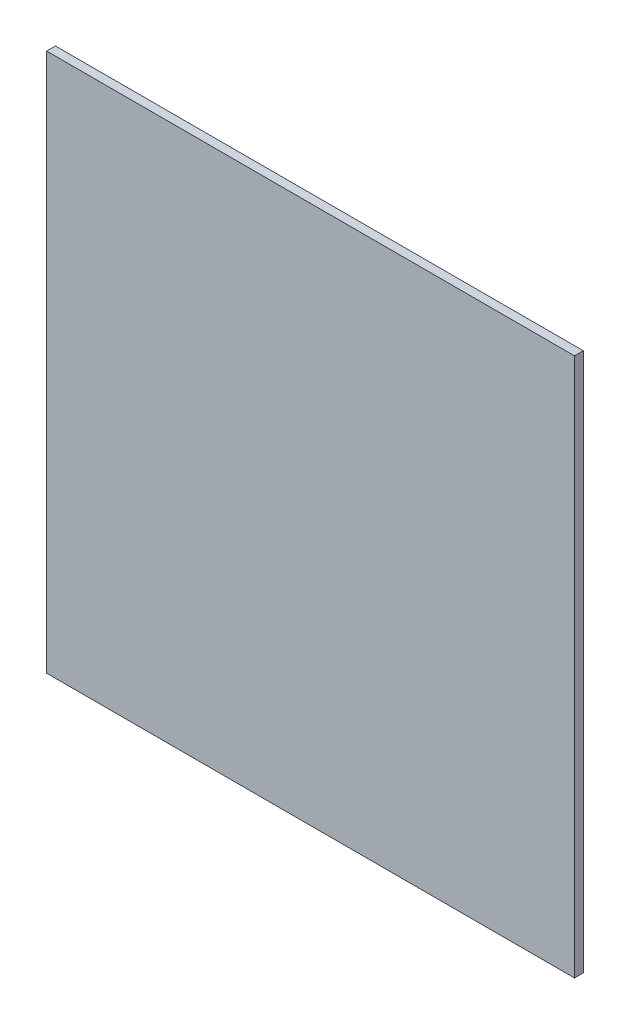
ISO-10303-21;
HEADER;
FILE_DESCRIPTION(('STEP AP214'),'2;1');
FILE_NAME('part.step','',(''),(''),'','','');
FILE_SCHEMA(('AUTOMOTIVE_DESIGN { 1 0 10303 214 1 1 1 1 }'));
ENDSEC;
DATA;
#1=APPLICATION_CONTEXT('core data for automotive mechanical design processes');
#2=APPLICATION_PROTOCOL_DEFINITION('international standard','automotive_design',2000,#1);
#3=PRODUCT_CONTEXT('',#1,'mechanical');
#4=PRODUCT('Part','Part','',(#3));
#5=PRODUCT_RELATED_PRODUCT_CATEGORY('part','',(#4));
#6=PRODUCT_DEFINITION_FORMATION('','',#4);
#7=PRODUCT_DEFINITION_CONTEXT('part definition',#1,'design');
#8=PRODUCT_DEFINITION('design','',#6,#7);
#9=PRODUCT_DEFINITION_SHAPE('','',#8);
#10=(LENGTH_UNIT() NAMED_UNIT(*) SI_UNIT(.MILLI.,.METRE.));
#11=(NAMED_UNIT(*) PLANE_ANGLE_UNIT() SI_UNIT($,.RADIAN.));
#12=(NAMED_UNIT(*) SI_UNIT($,.STERADIAN.) SOLID_ANGLE_UNIT());
#13=UNCERTAINTY_MEASURE_WITH_UNIT(LENGTH_MEASURE(1.E-05),#10,'distance_accuracy_value','');
#14=(GEOMETRIC_REPRESENTATION_CONTEXT(3) GLOBAL_UNCERTAINTY_ASSIGNED_CONTEXT((#13)) GLOBAL_UNIT_ASSIGNED_CONTEXT((#10,
#11,#12)) REPRESENTATION_CONTEXT('',''));
#15=CARTESIAN_POINT('',(0.,0.,0.));
#16=DIRECTION('',(0.,0.,1.));
#17=DIRECTION('',(1.,0.,0.));
#18=AXIS2_PLACEMENT_3D('',#15,#16,#17);
#19=CARTESIAN_POINT('',(240.,245.,8.));
#20=DIRECTION('',(-1.,0.,0.));
#21=DIRECTION('',(0.,-1.,0.));
#22=AXIS2_PLACEMENT_3D('',#19,#20,#21);
#23=PLANE('',#22);
#24=DIRECTION('',(0.,1.,0.));
#25=VECTOR('',#24,1.);
#26=CARTESIAN_POINT('',(240.,245.,0.));
#27=LINE('',#26,#25);
#28=CARTESIAN_POINT('',(240.,-245.,0.));
#29=VERTEX_POINT('',#28);
#30=CARTESIAN_POINT('',(240.,245.,0.));
#31=VERTEX_POINT('',#30);
#32=EDGE_CURVE('E95',#29,#31,#27,.T.);
#33=ORIENTED_EDGE('',*,*,#32,.T.);
#34=DIRECTION('',(0.,0.,-1.));
#35=VECTOR('',#34,1.);
#36=CARTESIAN_POINT('',(240.,245.,8.));
#37=LINE('',#36,#35);
#38=CARTESIAN_POINT('',(240.,245.,8.));
#39=VERTEX_POINT('',#38);
#40=EDGE_CURVE('E11',#39,#31,#37,.T.);
#41=ORIENTED_EDGE('',*,*,#40,.F.);
#42=DIRECTION('',(0.,1.,0.));
#43=VECTOR('',#42,1.);
#44=CARTESIAN_POINT('',(240.,245.,8.));
#45=LINE('',#44,#43);
#46=CARTESIAN_POINT('',(240.,-245.,8.));
#47=VERTEX_POINT('',#46);
#48=EDGE_CURVE('E83',#47,#39,#45,.T.);
#49=ORIENTED_EDGE('',*,*,#48,.F.);
#50=DIRECTION('',(0.,0.,-1.));
#51=VECTOR('',#50,1.);
#52=CARTESIAN_POINT('',(240.,-245.,8.));
#53=LINE('',#52,#51);
#54=EDGE_CURVE('E91',#47,#29,#53,.T.);
#55=ORIENTED_EDGE('',*,*,#54,.T.);
#56=EDGE_LOOP('',(#33,#41,#49,#55));
#57=FACE_BOUND('',#56,.T.);
#58=ADVANCED_FACE('F32',(#57),#23,.F.);
#59=CARTESIAN_POINT('',(-240.,245.,8.));
#60=DIRECTION('',(0.,-1.,0.));
#61=DIRECTION('',(0.,0.,-1.));
#62=AXIS2_PLACEMENT_3D('',#59,#60,#61);
#63=PLANE('',#62);
#64=DIRECTION('',(-1.,0.,0.));
#65=VECTOR('',#64,1.);
#66=CARTESIAN_POINT('',(-240.,245.,0.));
#67=LINE('',#66,#65);
#68=CARTESIAN_POINT('',(-240.,245.,0.));
#69=VERTEX_POINT('',#68);
#70=EDGE_CURVE('E87',#31,#69,#67,.T.);
#71=ORIENTED_EDGE('',*,*,#70,.T.);
#72=DIRECTION('',(0.,0.,-1.));
#73=VECTOR('',#72,1.);
#74=CARTESIAN_POINT('',(-240.,245.,8.));
#75=LINE('',#74,#73);
#76=CARTESIAN_POINT('',(-240.,245.,8.));
#77=VERTEX_POINT('',#76);
#78=EDGE_CURVE('E40',#77,#69,#75,.T.);
#79=ORIENTED_EDGE('',*,*,#78,.F.);
#80=DIRECTION('',(-1.,0.,0.));
#81=VECTOR('',#80,1.);
#82=CARTESIAN_POINT('',(-240.,245.,8.));
#83=LINE('',#82,#81);
#84=EDGE_CURVE('E78',#39,#77,#83,.T.);
#85=ORIENTED_EDGE('',*,*,#84,.F.);
#86=ORIENTED_EDGE('',*,*,#40,.T.);
#87=EDGE_LOOP('',(#71,#79,#85,#86));
#88=FACE_BOUND('',#87,.T.);
#89=ADVANCED_FACE('F86',(#88),#63,.F.);
#90=CARTESIAN_POINT('',(-240.,245.,8.));
#91=DIRECTION('',(1.,0.,0.));
#92=DIRECTION('',(0.,1.,0.));
#93=AXIS2_PLACEMENT_3D('',#90,#91,#92);
#94=PLANE('',#93);
#95=DIRECTION('',(0.,-1.,0.));
#96=VECTOR('',#95,1.);
#97=CARTESIAN_POINT('',(-240.,245.,0.));
#98=LINE('',#97,#96);
#99=CARTESIAN_POINT('',(-240.,-245.,0.));
#100=VERTEX_POINT('',#99);
#101=EDGE_CURVE('E65',#69,#100,#98,.T.);
#102=ORIENTED_EDGE('',*,*,#101,.T.);
#103=DIRECTION('',(0.,0.,-1.));
#104=VECTOR('',#103,1.);
#105=CARTESIAN_POINT('',(-240.,-245.,8.));
#106=LINE('',#105,#104);
#107=CARTESIAN_POINT('',(-240.,-245.,8.));
#108=VERTEX_POINT('',#107);
#109=EDGE_CURVE('E88',#108,#100,#106,.T.);
#110=ORIENTED_EDGE('',*,*,#109,.F.);
#111=DIRECTION('',(0.,-1.,0.));
#112=VECTOR('',#111,1.);
#113=CARTESIAN_POINT('',(-240.,245.,8.));
#114=LINE('',#113,#112);
#115=EDGE_CURVE('E81',#77,#108,#114,.T.);
#116=ORIENTED_EDGE('',*,*,#115,.F.);
#117=ORIENTED_EDGE('',*,*,#78,.T.);
#118=EDGE_LOOP('',(#102,#110,#116,#117));
#119=FACE_BOUND('',#118,.T.);
#120=ADVANCED_FACE('F89',(#119),#94,.F.);
#121=CARTESIAN_POINT('',(-240.,-245.,8.));
#122=DIRECTION('',(0.,1.,0.));
#123=DIRECTION('',(0.,0.,1.));
#124=AXIS2_PLACEMENT_3D('',#121,#122,#123);
#125=PLANE('',#124);
#126=DIRECTION('',(1.,0.,0.));
#127=VECTOR('',#126,1.);
#128=CARTESIAN_POINT('',(-240.,-245.,0.));
#129=LINE('',#128,#127);
#130=EDGE_CURVE('E71',#100,#29,#129,.T.);
#131=ORIENTED_EDGE('',*,*,#130,.T.);
#132=ORIENTED_EDGE('',*,*,#54,.F.);
#133=DIRECTION('',(1.,0.,0.));
#134=VECTOR('',#133,1.);
#135=CARTESIAN_POINT('',(-240.,-245.,8.));
#136=LINE('',#135,#134);
#137=EDGE_CURVE('E48',#108,#47,#136,.T.);
#138=ORIENTED_EDGE('',*,*,#137,.F.);
#139=ORIENTED_EDGE('',*,*,#109,.T.);
#140=EDGE_LOOP('',(#131,#132,#138,#139));
#141=FACE_BOUND('',#140,.T.);
#142=ADVANCED_FACE('F102',(#141),#125,.F.);
#143=CARTESIAN_POINT('',(0.,0.,8.));
#144=DIRECTION('',(0.,0.,1.));
#145=DIRECTION('',(1.,0.,0.));
#146=AXIS2_PLACEMENT_3D('',#143,#144,#145);
#147=PLANE('',#146);
#148=ORIENTED_EDGE('',*,*,#48,.T.);
#149=ORIENTED_EDGE('',*,*,#84,.T.);
#150=ORIENTED_EDGE('',*,*,#115,.T.);
#151=ORIENTED_EDGE('',*,*,#137,.T.);
#152=EDGE_LOOP('',(#148,#149,#150,#151));
#153=FACE_BOUND('',#152,.T.);
#154=ADVANCED_FACE('F79',(#153),#147,.T.);
#155=CARTESIAN_POINT('',(0.,0.,0.));
#156=DIRECTION('',(0.,0.,1.));
#157=DIRECTION('',(1.,0.,0.));
#158=AXIS2_PLACEMENT_3D('',#155,#156,#157);
#159=PLANE('',#158);
#160=ORIENTED_EDGE('',*,*,#32,.F.);
#161=ORIENTED_EDGE('',*,*,#130,.F.);
#162=ORIENTED_EDGE('',*,*,#101,.F.);
#163=ORIENTED_EDGE('',*,*,#70,.F.);
#164=EDGE_LOOP('',(#160,#161,#162,#163));
#165=FACE_BOUND('',#164,.T.);
#166=ADVANCED_FACE('F105',(#165),#159,.F.);
#167=CLOSED_SHELL('',(#58,#89,#120,#142,#154,#166));
#168=MANIFOLD_SOLID_BREP('B2',#167);
#169=ADVANCED_BREP_SHAPE_REPRESENTATION('',(#18,#168),#14);
#170=SHAPE_DEFINITION_REPRESENTATION(#9,#169);
ENDSEC;
END-ISO-10303-21;
